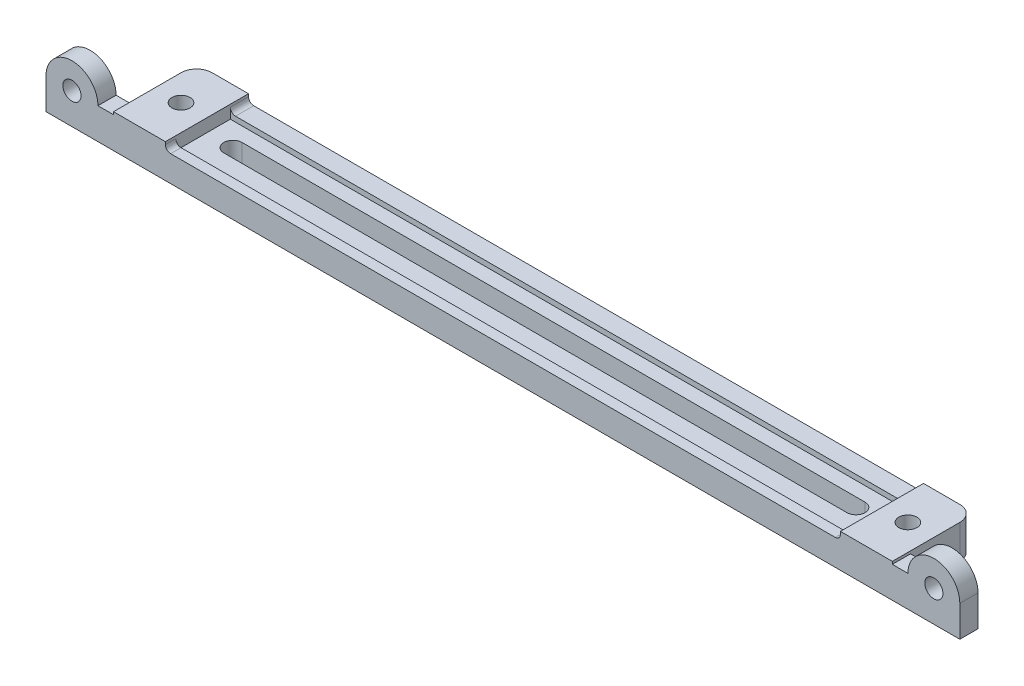
ISO-10303-21;
HEADER;
FILE_DESCRIPTION(('STEP AP214'),'2;1');
FILE_NAME('part.step','',(''),(''),'','','');
FILE_SCHEMA(('AUTOMOTIVE_DESIGN { 1 0 10303 214 1 1 1 1 }'));
ENDSEC;
DATA;
#1=APPLICATION_CONTEXT('core data for automotive mechanical design processes');
#2=APPLICATION_PROTOCOL_DEFINITION('international standard','automotive_design',2000,#1);
#3=PRODUCT_CONTEXT('',#1,'mechanical');
#4=PRODUCT('Part','Part','',(#3));
#5=PRODUCT_RELATED_PRODUCT_CATEGORY('part','',(#4));
#6=PRODUCT_DEFINITION_FORMATION('','',#4);
#7=PRODUCT_DEFINITION_CONTEXT('part definition',#1,'design');
#8=PRODUCT_DEFINITION('design','',#6,#7);
#9=PRODUCT_DEFINITION_SHAPE('','',#8);
#10=(LENGTH_UNIT() NAMED_UNIT(*) SI_UNIT(.MILLI.,.METRE.));
#11=(NAMED_UNIT(*) PLANE_ANGLE_UNIT() SI_UNIT($,.RADIAN.));
#12=(NAMED_UNIT(*) SI_UNIT($,.STERADIAN.) SOLID_ANGLE_UNIT());
#13=UNCERTAINTY_MEASURE_WITH_UNIT(LENGTH_MEASURE(1.E-05),#10,'distance_accuracy_value','');
#14=(GEOMETRIC_REPRESENTATION_CONTEXT(3) GLOBAL_UNCERTAINTY_ASSIGNED_CONTEXT((#13)) GLOBAL_UNIT_ASSIGNED_CONTEXT((#10,
#11,#12)) REPRESENTATION_CONTEXT('',''));
#15=CARTESIAN_POINT('',(0.,0.,0.));
#16=DIRECTION('',(0.,0.,1.));
#17=DIRECTION('',(1.,0.,0.));
#18=AXIS2_PLACEMENT_3D('',#15,#16,#17);
#19=CARTESIAN_POINT('',(-75.,4.,0.));
#20=DIRECTION('',(-1.,0.,0.));
#21=DIRECTION('',(0.,0.,1.));
#22=AXIS2_PLACEMENT_3D('',#19,#20,#21);
#23=PLANE('',#22);
#24=DIRECTION('',(0.,-1.,0.));
#25=VECTOR('',#24,1.);
#26=CARTESIAN_POINT('',(-75.,0.,4.49999999999999));
#27=LINE('',#26,#25);
#28=CARTESIAN_POINT('',(-75.,6.,4.49999999999999));
#29=VERTEX_POINT('',#28);
#30=CARTESIAN_POINT('',(-75.,0.,4.49999999999999));
#31=VERTEX_POINT('',#30);
#32=EDGE_CURVE('E286',#29,#31,#27,.T.);
#33=ORIENTED_EDGE('',*,*,#32,.F.);
#34=DIRECTION('',(0.,0.,1.));
#35=VECTOR('',#34,1.);
#36=CARTESIAN_POINT('',(-75.,6.,4.49999999999999));
#37=LINE('',#36,#35);
#38=CARTESIAN_POINT('',(-75.,6.,7.99999999999999));
#39=VERTEX_POINT('',#38);
#40=EDGE_CURVE('E307',#29,#39,#37,.T.);
#41=ORIENTED_EDGE('',*,*,#40,.T.);
#42=DIRECTION('',(0.,-1.,0.));
#43=VECTOR('',#42,1.);
#44=CARTESIAN_POINT('',(-75.,4.,8.00000000000001));
#45=LINE('',#44,#43);
#46=CARTESIAN_POINT('',(-75.,6.5,8.00000000000001));
#47=VERTEX_POINT('',#46);
#48=EDGE_CURVE('E442',#47,#39,#45,.T.);
#49=ORIENTED_EDGE('',*,*,#48,.F.);
#50=DIRECTION('',(0.,0.,1.));
#51=VECTOR('',#50,1.);
#52=CARTESIAN_POINT('',(-75.,6.5,-4.99999999999997));
#53=LINE('',#52,#51);
#54=CARTESIAN_POINT('',(-75.,6.5,-4.99999999999997));
#55=VERTEX_POINT('',#54);
#56=EDGE_CURVE('E325',#55,#47,#53,.T.);
#57=ORIENTED_EDGE('',*,*,#56,.F.);
#58=DIRECTION('',(0.,-1.,0.));
#59=VECTOR('',#58,1.);
#60=CARTESIAN_POINT('',(-75.,4.,-4.99999999999997));
#61=LINE('',#60,#59);
#62=CARTESIAN_POINT('',(-75.,0.,-4.99999999999997));
#63=VERTEX_POINT('',#62);
#64=EDGE_CURVE('E445',#55,#63,#61,.T.);
#65=ORIENTED_EDGE('',*,*,#64,.T.);
#66=DIRECTION('',(0.,0.,-1.));
#67=VECTOR('',#66,1.);
#68=CARTESIAN_POINT('',(-75.,0.,0.));
#69=LINE('',#68,#67);
#70=EDGE_CURVE('E427',#31,#63,#69,.T.);
#71=ORIENTED_EDGE('',*,*,#70,.F.);
#72=EDGE_LOOP('',(#33,#41,#49,#57,#65,#71));
#73=FACE_BOUND('',#72,.T.);
#74=ADVANCED_FACE('F35',(#73),#23,.T.);
#75=CARTESIAN_POINT('',(0.,5.,0.));
#76=DIRECTION('',(0.,1.,0.));
#77=DIRECTION('',(0.,0.,1.));
#78=AXIS2_PLACEMENT_3D('',#75,#76,#77);
#79=PLANE('',#78);
#80=DIRECTION('',(1.,0.,0.));
#81=VECTOR('',#80,1.);
#82=CARTESIAN_POINT('',(0.,5.,-4.50000000000002));
#83=LINE('',#82,#81);
#84=CARTESIAN_POINT('',(-64.,5.,-4.50000000000002));
#85=VERTEX_POINT('',#84);
#86=CARTESIAN_POINT('',(64.,5.,-4.50000000000002));
#87=VERTEX_POINT('',#86);
#88=EDGE_CURVE('E368',#85,#87,#83,.T.);
#89=ORIENTED_EDGE('',*,*,#88,.T.);
#90=DIRECTION('',(0.,0.,1.));
#91=VECTOR('',#90,1.);
#92=CARTESIAN_POINT('',(64.,5.,-8.00000000000001));
#93=LINE('',#92,#91);
#94=CARTESIAN_POINT('',(64.,5.,-8.00000000000001));
#95=VERTEX_POINT('',#94);
#96=EDGE_CURVE('E467',#87,#95,#93,.F.);
#97=ORIENTED_EDGE('',*,*,#96,.T.);
#98=DIRECTION('',(-1.,0.,0.));
#99=VECTOR('',#98,1.);
#100=CARTESIAN_POINT('',(0.,5.,-8.00000000000001));
#101=LINE('',#100,#99);
#102=CARTESIAN_POINT('',(-64.,5.,-8.));
#103=VERTEX_POINT('',#102);
#104=EDGE_CURVE('E361',#95,#103,#101,.T.);
#105=ORIENTED_EDGE('',*,*,#104,.T.);
#106=DIRECTION('',(0.,0.,1.));
#107=VECTOR('',#106,1.);
#108=CARTESIAN_POINT('',(-64.,5.,0.));
#109=LINE('',#108,#107);
#110=EDGE_CURVE('E464',#103,#85,#109,.T.);
#111=ORIENTED_EDGE('',*,*,#110,.T.);
#112=EDGE_LOOP('',(#89,#97,#105,#111));
#113=FACE_BOUND('',#112,.T.);
#114=ADVANCED_FACE('F556',(#113),#79,.T.);
#115=DIRECTION('',(1.,0.,0.));
#116=VECTOR('',#115,1.);
#117=CARTESIAN_POINT('',(0.,5.,7.99999999999999));
#118=LINE('',#117,#116);
#119=CARTESIAN_POINT('',(-64.0000000000001,5.,8.));
#120=VERTEX_POINT('',#119);
#121=CARTESIAN_POINT('',(64.,5.,7.99999999999998));
#122=VERTEX_POINT('',#121);
#123=EDGE_CURVE('E364',#120,#122,#118,.T.);
#124=ORIENTED_EDGE('',*,*,#123,.T.);
#125=DIRECTION('',(0.,0.,1.));
#126=VECTOR('',#125,1.);
#127=CARTESIAN_POINT('',(64.,5.,5.99999999999998));
#128=LINE('',#127,#126);
#129=CARTESIAN_POINT('',(64.,5.,5.99999999999998));
#130=VERTEX_POINT('',#129);
#131=EDGE_CURVE('E471',#122,#130,#128,.F.);
#132=ORIENTED_EDGE('',*,*,#131,.T.);
#133=DIRECTION('',(1.,0.,0.));
#134=VECTOR('',#133,1.);
#135=CARTESIAN_POINT('',(0.,5.,5.99999999999998));
#136=LINE('',#135,#134);
#137=CARTESIAN_POINT('',(-64.0000000000001,5.,5.99999999999998));
#138=VERTEX_POINT('',#137);
#139=EDGE_CURVE('E371',#138,#130,#136,.T.);
#140=ORIENTED_EDGE('',*,*,#139,.F.);
#141=DIRECTION('',(0.,0.,-1.));
#142=VECTOR('',#141,1.);
#143=CARTESIAN_POINT('',(-64.,5.,0.));
#144=LINE('',#143,#142);
#145=EDGE_CURVE('E469',#138,#120,#144,.F.);
#146=ORIENTED_EDGE('',*,*,#145,.T.);
#147=EDGE_LOOP('',(#124,#132,#140,#146));
#148=FACE_BOUND('',#147,.T.);
#149=ADVANCED_FACE('F501',(#148),#79,.T.);
#150=CARTESIAN_POINT('',(0.,4.,-8.00000000000001));
#151=DIRECTION('',(0.,0.,1.));
#152=DIRECTION('',(1.,0.,0.));
#153=AXIS2_PLACEMENT_3D('',#150,#151,#152);
#154=PLANE('',#153);
#155=DIRECTION('',(-1.,0.,0.));
#156=VECTOR('',#155,1.);
#157=CARTESIAN_POINT('',(0.,0.,-8.00000000000001));
#158=LINE('',#157,#156);
#159=CARTESIAN_POINT('',(72.,0.,-8.00000000000002));
#160=VERTEX_POINT('',#159);
#161=CARTESIAN_POINT('',(-72.,0.,-7.99999999999999));
#162=VERTEX_POINT('',#161);
#163=EDGE_CURVE('E421',#160,#162,#158,.T.);
#164=ORIENTED_EDGE('',*,*,#163,.T.);
#165=DIRECTION('',(0.,-1.,0.));
#166=VECTOR('',#165,1.);
#167=CARTESIAN_POINT('',(-72.,4.,-7.99999999999999));
#168=LINE('',#167,#166);
#169=CARTESIAN_POINT('',(-72.,6.5,-8.));
#170=VERTEX_POINT('',#169);
#171=EDGE_CURVE('E448',#170,#162,#168,.T.);
#172=ORIENTED_EDGE('',*,*,#171,.F.);
#173=DIRECTION('',(-1.,0.,0.));
#174=VECTOR('',#173,1.);
#175=CARTESIAN_POINT('',(-65.0000000000001,6.5,-8.));
#176=LINE('',#175,#174);
#177=CARTESIAN_POINT('',(-65.0000000000001,6.5,-8.));
#178=VERTEX_POINT('',#177);
#179=EDGE_CURVE('E319',#178,#170,#176,.T.);
#180=ORIENTED_EDGE('',*,*,#179,.F.);
#181=DIRECTION('',(0.,-1.,0.));
#182=VECTOR('',#181,1.);
#183=CARTESIAN_POINT('',(-65.0000000000001,6.5,-8.));
#184=LINE('',#183,#182);
#185=CARTESIAN_POINT('',(-65.0000000000001,6.,-8.));
#186=VERTEX_POINT('',#185);
#187=EDGE_CURVE('E334',#178,#186,#184,.T.);
#188=ORIENTED_EDGE('',*,*,#187,.T.);
#189=CARTESIAN_POINT('',(-64.,6.,-8.));
#190=DIRECTION('',(0.,0.,1.));
#191=DIRECTION('',(1.,0.,0.));
#192=AXIS2_PLACEMENT_3D('',#189,#190,#191);
#193=CIRCLE('',#192,1.);
#194=EDGE_CURVE('E490',#186,#103,#193,.T.);
#195=ORIENTED_EDGE('',*,*,#194,.T.);
#196=ORIENTED_EDGE('',*,*,#104,.F.);
#197=CARTESIAN_POINT('',(64.,6.,-8.00000000000001));
#198=DIRECTION('',(0.,0.,1.));
#199=DIRECTION('',(1.,0.,0.));
#200=AXIS2_PLACEMENT_3D('',#197,#198,#199);
#201=CIRCLE('',#200,1.);
#202=CARTESIAN_POINT('',(65.,6.,-8.00000000000002));
#203=VERTEX_POINT('',#202);
#204=EDGE_CURVE('E480',#95,#203,#201,.T.);
#205=ORIENTED_EDGE('',*,*,#204,.T.);
#206=DIRECTION('',(0.,-1.,0.));
#207=VECTOR('',#206,1.);
#208=CARTESIAN_POINT('',(65.,6.5,-8.00000000000002));
#209=LINE('',#208,#207);
#210=CARTESIAN_POINT('',(65.,6.5,-8.00000000000002));
#211=VERTEX_POINT('',#210);
#212=EDGE_CURVE('E354',#211,#203,#209,.T.);
#213=ORIENTED_EDGE('',*,*,#212,.F.);
#214=DIRECTION('',(-1.,0.,0.));
#215=VECTOR('',#214,1.);
#216=CARTESIAN_POINT('',(72.,6.5,-8.00000000000002));
#217=LINE('',#216,#215);
#218=CARTESIAN_POINT('',(72.,6.5,-8.00000000000002));
#219=VERTEX_POINT('',#218);
#220=EDGE_CURVE('E351',#219,#211,#217,.T.);
#221=ORIENTED_EDGE('',*,*,#220,.F.);
#222=DIRECTION('',(0.,-1.,0.));
#223=VECTOR('',#222,1.);
#224=CARTESIAN_POINT('',(72.,4.,-8.00000000000002));
#225=LINE('',#224,#223);
#226=EDGE_CURVE('E435',#219,#160,#225,.T.);
#227=ORIENTED_EDGE('',*,*,#226,.T.);
#228=EDGE_LOOP('',(#164,#172,#180,#188,#195,#196,#205,#213,#221,#227));
#229=FACE_BOUND('',#228,.T.);
#230=ADVANCED_FACE('F571',(#229),#154,.F.);
#231=CARTESIAN_POINT('',(-72.,4.,-5.));
#232=DIRECTION('',(0.,-1.,0.));
#233=DIRECTION('',(0.,0.,-1.));
#234=AXIS2_PLACEMENT_3D('',#231,#232,#233);
#235=CYLINDRICAL_SURFACE('',#234,3.);
#236=CARTESIAN_POINT('',(-72.,0.,-5.));
#237=DIRECTION('',(0.,1.,0.));
#238=DIRECTION('',(0.,0.,1.));
#239=AXIS2_PLACEMENT_3D('',#236,#237,#238);
#240=CIRCLE('',#239,3.);
#241=EDGE_CURVE('E424',#162,#63,#240,.T.);
#242=ORIENTED_EDGE('',*,*,#241,.T.);
#243=ORIENTED_EDGE('',*,*,#64,.F.);
#244=CARTESIAN_POINT('',(-72.,6.5,-4.99999999999999));
#245=DIRECTION('',(0.,1.,0.));
#246=DIRECTION('',(0.,0.,1.));
#247=AXIS2_PLACEMENT_3D('',#244,#245,#246);
#248=CIRCLE('',#247,3.00000000000001);
#249=EDGE_CURVE('E322',#170,#55,#248,.T.);
#250=ORIENTED_EDGE('',*,*,#249,.F.);
#251=ORIENTED_EDGE('',*,*,#171,.T.);
#252=EDGE_LOOP('',(#242,#243,#250,#251));
#253=FACE_BOUND('',#252,.T.);
#254=ADVANCED_FACE('F568',(#253),#235,.T.);
#255=CARTESIAN_POINT('',(0.,4.,7.99999999999999));
#256=DIRECTION('',(0.,0.,1.));
#257=DIRECTION('',(1.,0.,0.));
#258=AXIS2_PLACEMENT_3D('',#255,#256,#257);
#259=PLANE('',#258);
#260=DIRECTION('',(-1.,0.,0.));
#261=VECTOR('',#260,1.);
#262=CARTESIAN_POINT('',(0.,0.,7.99999999999999));
#263=LINE('',#262,#261);
#264=CARTESIAN_POINT('',(88.,1.4209566642787E-12,7.99999999999999));
#265=VERTEX_POINT('',#264);
#266=CARTESIAN_POINT('',(-88.,0.,7.99999999999999));
#267=VERTEX_POINT('',#266);
#268=EDGE_CURVE('E429',#265,#267,#263,.T.);
#269=ORIENTED_EDGE('',*,*,#268,.F.);
#270=DIRECTION('',(0.,1.,0.));
#271=VECTOR('',#270,1.);
#272=CARTESIAN_POINT('',(88.,1.22124532708767E-12,7.99999999999999));
#273=LINE('',#272,#271);
#274=CARTESIAN_POINT('',(88.,6.00000000000142,7.99999999999999));
#275=VERTEX_POINT('',#274);
#276=EDGE_CURVE('E269',#265,#275,#273,.T.);
#277=ORIENTED_EDGE('',*,*,#276,.T.);
#278=CARTESIAN_POINT('',(82.9999999999999,6.00000000000134,7.99999999999999));
#279=DIRECTION('',(0.,0.,1.));
#280=DIRECTION('',(1.,0.,0.));
#281=AXIS2_PLACEMENT_3D('',#278,#279,#280);
#282=CIRCLE('',#281,5.);
#283=CARTESIAN_POINT('',(77.9999999999999,6.00000000000126,7.99999999999999));
#284=VERTEX_POINT('',#283);
#285=EDGE_CURVE('E235',#275,#284,#282,.T.);
#286=ORIENTED_EDGE('',*,*,#285,.T.);
#287=DIRECTION('',(-1.,0.,0.));
#288=VECTOR('',#287,1.);
#289=CARTESIAN_POINT('',(0.,5.99999999999999,7.99999999999999));
#290=LINE('',#289,#288);
#291=CARTESIAN_POINT('',(75.,6.00000000000123,7.99999999999998));
#292=VERTEX_POINT('',#291);
#293=EDGE_CURVE('E259',#284,#292,#290,.T.);
#294=ORIENTED_EDGE('',*,*,#293,.T.);
#295=DIRECTION('',(0.,-1.,0.));
#296=VECTOR('',#295,1.);
#297=CARTESIAN_POINT('',(75.,4.,7.99999999999998));
#298=LINE('',#297,#296);
#299=CARTESIAN_POINT('',(75.,6.5,7.99999999999998));
#300=VERTEX_POINT('',#299);
#301=EDGE_CURVE('E55',#300,#292,#298,.T.);
#302=ORIENTED_EDGE('',*,*,#301,.F.);
#303=DIRECTION('',(1.,0.,0.));
#304=VECTOR('',#303,1.);
#305=CARTESIAN_POINT('',(65.,6.5,7.99999999999998));
#306=LINE('',#305,#304);
#307=CARTESIAN_POINT('',(65.,6.5,7.99999999999998));
#308=VERTEX_POINT('',#307);
#309=EDGE_CURVE('E342',#308,#300,#306,.T.);
#310=ORIENTED_EDGE('',*,*,#309,.F.);
#311=DIRECTION('',(0.,-1.,0.));
#312=VECTOR('',#311,1.);
#313=CARTESIAN_POINT('',(65.,6.5,7.99999999999998));
#314=LINE('',#313,#312);
#315=CARTESIAN_POINT('',(65.,6.,7.99999999999998));
#316=VERTEX_POINT('',#315);
#317=EDGE_CURVE('E357',#308,#316,#314,.T.);
#318=ORIENTED_EDGE('',*,*,#317,.T.);
#319=CARTESIAN_POINT('',(64.,6.,7.99999999999998));
#320=DIRECTION('',(0.,0.,1.));
#321=DIRECTION('',(1.,0.,0.));
#322=AXIS2_PLACEMENT_3D('',#319,#320,#321);
#323=CIRCLE('',#322,1.);
#324=EDGE_CURVE('E482',#316,#122,#323,.F.);
#325=ORIENTED_EDGE('',*,*,#324,.T.);
#326=ORIENTED_EDGE('',*,*,#123,.F.);
#327=CARTESIAN_POINT('',(-64.0000000000001,6.,8.));
#328=DIRECTION('',(0.,0.,1.));
#329=DIRECTION('',(1.,0.,0.));
#330=AXIS2_PLACEMENT_3D('',#327,#328,#329);
#331=CIRCLE('',#330,1.);
#332=CARTESIAN_POINT('',(-65.,6.,8.));
#333=VERTEX_POINT('',#332);
#334=EDGE_CURVE('E11',#120,#333,#331,.F.);
#335=ORIENTED_EDGE('',*,*,#334,.T.);
#336=DIRECTION('',(0.,-1.,0.));
#337=VECTOR('',#336,1.);
#338=CARTESIAN_POINT('',(-65.,6.5,8.));
#339=LINE('',#338,#337);
#340=CARTESIAN_POINT('',(-65.,6.5,8.));
#341=VERTEX_POINT('',#340);
#342=EDGE_CURVE('E331',#341,#333,#339,.T.);
#343=ORIENTED_EDGE('',*,*,#342,.F.);
#344=DIRECTION('',(1.,0.,0.));
#345=VECTOR('',#344,1.);
#346=CARTESIAN_POINT('',(-75.,6.5,8.00000000000001));
#347=LINE('',#346,#345);
#348=EDGE_CURVE('E328',#47,#341,#347,.T.);
#349=ORIENTED_EDGE('',*,*,#348,.F.);
#350=ORIENTED_EDGE('',*,*,#48,.T.);
#351=DIRECTION('',(1.,0.,0.));
#352=VECTOR('',#351,1.);
#353=CARTESIAN_POINT('',(0.,6.,7.99999999999999));
#354=LINE('',#353,#352);
#355=CARTESIAN_POINT('',(-78.,6.,7.99999999999999));
#356=VERTEX_POINT('',#355);
#357=EDGE_CURVE('E299',#356,#39,#354,.T.);
#358=ORIENTED_EDGE('',*,*,#357,.F.);
#359=CARTESIAN_POINT('',(-83.,6.,7.99999999999999));
#360=DIRECTION('',(0.,0.,1.));
#361=DIRECTION('',(1.,0.,0.));
#362=AXIS2_PLACEMENT_3D('',#359,#360,#361);
#363=CIRCLE('',#362,5.);
#364=CARTESIAN_POINT('',(-88.,6.,7.99999999999999));
#365=VERTEX_POINT('',#364);
#366=EDGE_CURVE('E275',#365,#356,#363,.F.);
#367=ORIENTED_EDGE('',*,*,#366,.F.);
#368=DIRECTION('',(0.,1.,0.));
#369=VECTOR('',#368,1.);
#370=CARTESIAN_POINT('',(-88.,0.,7.99999999999999));
#371=LINE('',#370,#369);
#372=EDGE_CURVE('E297',#267,#365,#371,.T.);
#373=ORIENTED_EDGE('',*,*,#372,.F.);
#374=EDGE_LOOP('',(#269,#277,#286,#294,#302,#310,#318,#325,#326,#335,#343,#349,#350,#358,#367,#373));
#375=FACE_BOUND('',#374,.T.);
#376=CARTESIAN_POINT('',(-83.,6.,7.99999999999999));
#377=DIRECTION('',(0.,0.,1.));
#378=DIRECTION('',(1.,0.,0.));
#379=AXIS2_PLACEMENT_3D('',#376,#377,#378);
#380=CIRCLE('',#379,1.75);
#381=CARTESIAN_POINT('',(-81.25,6.,7.99999999999999));
#382=VERTEX_POINT('',#381);
#383=EDGE_CURVE('E282',#382,#382,#380,.T.);
#384=ORIENTED_EDGE('',*,*,#383,.F.);
#385=EDGE_LOOP('',(#384));
#386=FACE_BOUND('',#385,.T.);
#387=CARTESIAN_POINT('',(82.9999999999999,6.00000000000134,7.99999999999999));
#388=DIRECTION('',(0.,0.,1.));
#389=DIRECTION('',(1.,0.,0.));
#390=AXIS2_PLACEMENT_3D('',#387,#388,#389);
#391=CIRCLE('',#390,1.75000000000002);
#392=CARTESIAN_POINT('',(84.75,6.00000000000134,7.99999999999999));
#393=VERTEX_POINT('',#392);
#394=EDGE_CURVE('E266',#393,#393,#391,.F.);
#395=ORIENTED_EDGE('',*,*,#394,.T.);
#396=EDGE_LOOP('',(#395));
#397=FACE_BOUND('',#396,.T.);
#398=ADVANCED_FACE('F507',(#375,#386,#397),#259,.T.);
#399=CARTESIAN_POINT('',(75.,4.,0.));
#400=DIRECTION('',(-1.,0.,0.));
#401=DIRECTION('',(0.,0.,1.));
#402=AXIS2_PLACEMENT_3D('',#399,#400,#401);
#403=PLANE('',#402);
#404=ORIENTED_EDGE('',*,*,#301,.T.);
#405=DIRECTION('',(0.,0.,1.));
#406=VECTOR('',#405,1.);
#407=CARTESIAN_POINT('',(75.,6.00000000000121,4.49999999999999));
#408=LINE('',#407,#406);
#409=CARTESIAN_POINT('',(75.,6.00000000000121,4.49999999999999));
#410=VERTEX_POINT('',#409);
#411=EDGE_CURVE('E50',#410,#292,#408,.T.);
#412=ORIENTED_EDGE('',*,*,#411,.F.);
#413=DIRECTION('',(0.,1.,0.));
#414=VECTOR('',#413,1.);
#415=CARTESIAN_POINT('',(75.,0.,4.49999999999999));
#416=LINE('',#415,#414);
#417=CARTESIAN_POINT('',(75.,0.,4.49999999999999));
#418=VERTEX_POINT('',#417);
#419=EDGE_CURVE('E263',#418,#410,#416,.T.);
#420=ORIENTED_EDGE('',*,*,#419,.F.);
#421=DIRECTION('',(0.,0.,-1.));
#422=VECTOR('',#421,1.);
#423=CARTESIAN_POINT('',(75.,0.,0.));
#424=LINE('',#423,#422);
#425=CARTESIAN_POINT('',(75.,0.,-4.99999999999999));
#426=VERTEX_POINT('',#425);
#427=EDGE_CURVE('E431',#418,#426,#424,.T.);
#428=ORIENTED_EDGE('',*,*,#427,.T.);
#429=DIRECTION('',(0.,-1.,0.));
#430=VECTOR('',#429,1.);
#431=CARTESIAN_POINT('',(75.,4.,-4.99999999999999));
#432=LINE('',#431,#430);
#433=CARTESIAN_POINT('',(75.,6.5,-4.99999999999999));
#434=VERTEX_POINT('',#433);
#435=EDGE_CURVE('E437',#434,#426,#432,.T.);
#436=ORIENTED_EDGE('',*,*,#435,.F.);
#437=DIRECTION('',(0.,0.,-1.));
#438=VECTOR('',#437,1.);
#439=CARTESIAN_POINT('',(75.,6.5,7.99999999999998));
#440=LINE('',#439,#438);
#441=EDGE_CURVE('E345',#300,#434,#440,.T.);
#442=ORIENTED_EDGE('',*,*,#441,.F.);
#443=EDGE_LOOP('',(#404,#412,#420,#428,#436,#442));
#444=FACE_BOUND('',#443,.T.);
#445=ADVANCED_FACE('F600',(#444),#403,.F.);
#446=CARTESIAN_POINT('',(0.,4.,-1.75000000000001));
#447=DIRECTION('',(0.,0.,1.));
#448=DIRECTION('',(1.,0.,0.));
#449=AXIS2_PLACEMENT_3D('',#446,#447,#448);
#450=PLANE('',#449);
#451=DIRECTION('',(-1.,0.,0.));
#452=VECTOR('',#451,1.);
#453=CARTESIAN_POINT('',(0.,0.,-1.75000000000001));
#454=LINE('',#453,#452);
#455=CARTESIAN_POINT('',(60.,0.,-1.75000000000002));
#456=VERTEX_POINT('',#455);
#457=CARTESIAN_POINT('',(-60.,0.,-1.75));
#458=VERTEX_POINT('',#457);
#459=EDGE_CURVE('E392',#456,#458,#454,.T.);
#460=ORIENTED_EDGE('',*,*,#459,.F.);
#461=DIRECTION('',(0.,-1.,0.));
#462=VECTOR('',#461,1.);
#463=CARTESIAN_POINT('',(60.,4.,-1.75000000000002));
#464=LINE('',#463,#462);
#465=CARTESIAN_POINT('',(60.,4.,-1.75000000000002));
#466=VERTEX_POINT('',#465);
#467=EDGE_CURVE('E438',#466,#456,#464,.T.);
#468=ORIENTED_EDGE('',*,*,#467,.F.);
#469=DIRECTION('',(-1.,0.,0.));
#470=VECTOR('',#469,1.);
#471=CARTESIAN_POINT('',(0.,4.,-1.75000000000001));
#472=LINE('',#471,#470);
#473=CARTESIAN_POINT('',(-60.,4.,-1.75));
#474=VERTEX_POINT('',#473);
#475=EDGE_CURVE('E393',#466,#474,#472,.T.);
#476=ORIENTED_EDGE('',*,*,#475,.T.);
#477=DIRECTION('',(0.,-1.,0.));
#478=VECTOR('',#477,1.);
#479=CARTESIAN_POINT('',(-60.,4.,-1.75));
#480=LINE('',#479,#478);
#481=EDGE_CURVE('E404',#474,#458,#480,.T.);
#482=ORIENTED_EDGE('',*,*,#481,.T.);
#483=EDGE_LOOP('',(#460,#468,#476,#482));
#484=FACE_BOUND('',#483,.T.);
#485=ADVANCED_FACE('F596',(#484),#450,.T.);
#486=CARTESIAN_POINT('',(60.,4.,-2.11419423634673E-13));
#487=DIRECTION('',(0.,-1.,0.));
#488=DIRECTION('',(0.,0.,-1.));
#489=AXIS2_PLACEMENT_3D('',#486,#487,#488);
#490=CYLINDRICAL_SURFACE('',#489,1.75);
#491=CARTESIAN_POINT('',(60.,0.,-2.11419423634673E-13));
#492=DIRECTION('',(0.,1.,0.));
#493=DIRECTION('',(0.,0.,1.));
#494=AXIS2_PLACEMENT_3D('',#491,#492,#493);
#495=CIRCLE('',#494,1.75);
#496=CARTESIAN_POINT('',(60.,0.,1.74999999999998));
#497=VERTEX_POINT('',#496);
#498=EDGE_CURVE('E407',#456,#497,#495,.F.);
#499=ORIENTED_EDGE('',*,*,#498,.T.);
#500=DIRECTION('',(0.,-1.,0.));
#501=VECTOR('',#500,1.);
#502=CARTESIAN_POINT('',(60.,4.,1.74999999999998));
#503=LINE('',#502,#501);
#504=CARTESIAN_POINT('',(60.,4.,1.74999999999998));
#505=VERTEX_POINT('',#504);
#506=EDGE_CURVE('E455',#505,#497,#503,.T.);
#507=ORIENTED_EDGE('',*,*,#506,.F.);
#508=CARTESIAN_POINT('',(60.,4.,-2.11419423634673E-13));
#509=DIRECTION('',(0.,1.,0.));
#510=DIRECTION('',(0.,0.,1.));
#511=AXIS2_PLACEMENT_3D('',#508,#509,#510);
#512=CIRCLE('',#511,1.75);
#513=EDGE_CURVE('E396',#466,#505,#512,.F.);
#514=ORIENTED_EDGE('',*,*,#513,.F.);
#515=ORIENTED_EDGE('',*,*,#467,.T.);
#516=EDGE_LOOP('',(#499,#507,#514,#515));
#517=FACE_BOUND('',#516,.T.);
#518=ADVANCED_FACE('F592',(#517),#490,.F.);
#519=CARTESIAN_POINT('',(0.,4.,1.74999999999999));
#520=DIRECTION('',(0.,0.,1.));
#521=DIRECTION('',(1.,0.,0.));
#522=AXIS2_PLACEMENT_3D('',#519,#520,#521);
#523=PLANE('',#522);
#524=DIRECTION('',(-1.,0.,0.));
#525=VECTOR('',#524,1.);
#526=CARTESIAN_POINT('',(0.,0.,1.74999999999999));
#527=LINE('',#526,#525);
#528=CARTESIAN_POINT('',(-60.,0.,1.75));
#529=VERTEX_POINT('',#528);
#530=EDGE_CURVE('E409',#497,#529,#527,.T.);
#531=ORIENTED_EDGE('',*,*,#530,.T.);
#532=DIRECTION('',(0.,-1.,0.));
#533=VECTOR('',#532,1.);
#534=CARTESIAN_POINT('',(-60.,4.,1.75));
#535=LINE('',#534,#533);
#536=CARTESIAN_POINT('',(-60.,4.,1.75));
#537=VERTEX_POINT('',#536);
#538=EDGE_CURVE('E453',#537,#529,#535,.T.);
#539=ORIENTED_EDGE('',*,*,#538,.F.);
#540=DIRECTION('',(-1.,0.,0.));
#541=VECTOR('',#540,1.);
#542=CARTESIAN_POINT('',(0.,4.,1.74999999999999));
#543=LINE('',#542,#541);
#544=EDGE_CURVE('E399',#505,#537,#543,.T.);
#545=ORIENTED_EDGE('',*,*,#544,.F.);
#546=ORIENTED_EDGE('',*,*,#506,.T.);
#547=EDGE_LOOP('',(#531,#539,#545,#546));
#548=FACE_BOUND('',#547,.T.);
#549=ADVANCED_FACE('F580',(#548),#523,.F.);
#550=CARTESIAN_POINT('',(-70.,4.,0.));
#551=DIRECTION('',(0.,-1.,0.));
#552=DIRECTION('',(0.,0.,-1.));
#553=AXIS2_PLACEMENT_3D('',#550,#551,#552);
#554=CYLINDRICAL_SURFACE('',#553,1.75);
#555=CARTESIAN_POINT('',(-70.,0.,0.));
#556=DIRECTION('',(0.,1.,0.));
#557=DIRECTION('',(0.,0.,1.));
#558=AXIS2_PLACEMENT_3D('',#555,#556,#557);
#559=CIRCLE('',#558,1.75);
#560=CARTESIAN_POINT('',(-70.,0.,1.75));
#561=VERTEX_POINT('',#560);
#562=EDGE_CURVE('E418',#561,#561,#559,.T.);
#563=ORIENTED_EDGE('',*,*,#562,.F.);
#564=EDGE_LOOP('',(#563));
#565=FACE_BOUND('',#564,.T.);
#566=CARTESIAN_POINT('',(-70.,6.5,0.));
#567=DIRECTION('',(0.,1.,0.));
#568=DIRECTION('',(0.,0.,1.));
#569=AXIS2_PLACEMENT_3D('',#566,#567,#568);
#570=CIRCLE('',#569,1.75);
#571=CARTESIAN_POINT('',(-70.,6.5,1.75));
#572=VERTEX_POINT('',#571);
#573=EDGE_CURVE('E306',#572,#572,#570,.T.);
#574=ORIENTED_EDGE('',*,*,#573,.T.);
#575=EDGE_LOOP('',(#574));
#576=FACE_BOUND('',#575,.T.);
#577=ADVANCED_FACE('F576',(#565,#576),#554,.F.);
#578=CARTESIAN_POINT('',(70.,4.,-2.42861286636753E-13));
#579=DIRECTION('',(0.,-1.,0.));
#580=DIRECTION('',(0.,0.,-1.));
#581=AXIS2_PLACEMENT_3D('',#578,#579,#580);
#582=CYLINDRICAL_SURFACE('',#581,1.75);
#583=CARTESIAN_POINT('',(70.,0.,-2.42861286636753E-13));
#584=DIRECTION('',(0.,1.,0.));
#585=DIRECTION('',(0.,0.,1.));
#586=AXIS2_PLACEMENT_3D('',#583,#584,#585);
#587=CIRCLE('',#586,1.75);
#588=CARTESIAN_POINT('',(70.,0.,1.74999999999975));
#589=VERTEX_POINT('',#588);
#590=EDGE_CURVE('E415',#589,#589,#587,.F.);
#591=ORIENTED_EDGE('',*,*,#590,.T.);
#592=EDGE_LOOP('',(#591));
#593=FACE_BOUND('',#592,.T.);
#594=CARTESIAN_POINT('',(70.,6.5,-2.42861286636753E-13));
#595=DIRECTION('',(0.,1.,0.));
#596=DIRECTION('',(0.,0.,1.));
#597=AXIS2_PLACEMENT_3D('',#594,#595,#596);
#598=CIRCLE('',#597,1.75);
#599=CARTESIAN_POINT('',(70.,6.5,1.74999999999975));
#600=VERTEX_POINT('',#599);
#601=EDGE_CURVE('E337',#600,#600,#598,.T.);
#602=ORIENTED_EDGE('',*,*,#601,.T.);
#603=EDGE_LOOP('',(#602));
#604=FACE_BOUND('',#603,.T.);
#605=ADVANCED_FACE('F579',(#593,#604),#582,.F.);
#606=CARTESIAN_POINT('',(-60.,4.,0.));
#607=DIRECTION('',(0.,-1.,0.));
#608=DIRECTION('',(0.,0.,-1.));
#609=AXIS2_PLACEMENT_3D('',#606,#607,#608);
#610=CYLINDRICAL_SURFACE('',#609,1.75);
#611=CARTESIAN_POINT('',(-60.,0.,0.));
#612=DIRECTION('',(0.,1.,0.));
#613=DIRECTION('',(0.,0.,1.));
#614=AXIS2_PLACEMENT_3D('',#611,#612,#613);
#615=CIRCLE('',#614,1.75);
#616=EDGE_CURVE('E412',#458,#529,#615,.T.);
#617=ORIENTED_EDGE('',*,*,#616,.F.);
#618=ORIENTED_EDGE('',*,*,#481,.F.);
#619=CARTESIAN_POINT('',(-60.,4.,0.));
#620=DIRECTION('',(0.,1.,0.));
#621=DIRECTION('',(0.,0.,1.));
#622=AXIS2_PLACEMENT_3D('',#619,#620,#621);
#623=CIRCLE('',#622,1.75);
#624=EDGE_CURVE('E401',#474,#537,#623,.T.);
#625=ORIENTED_EDGE('',*,*,#624,.T.);
#626=ORIENTED_EDGE('',*,*,#538,.T.);
#627=EDGE_LOOP('',(#617,#618,#625,#626));
#628=FACE_BOUND('',#627,.T.);
#629=ADVANCED_FACE('F584',(#628),#610,.F.);
#630=CARTESIAN_POINT('',(72.,4.,-5.00000000000002));
#631=DIRECTION('',(0.,-1.,0.));
#632=DIRECTION('',(0.,0.,-1.));
#633=AXIS2_PLACEMENT_3D('',#630,#631,#632);
#634=CYLINDRICAL_SURFACE('',#633,3.);
#635=CARTESIAN_POINT('',(72.,0.,-5.00000000000002));
#636=DIRECTION('',(0.,1.,0.));
#637=DIRECTION('',(0.,0.,1.));
#638=AXIS2_PLACEMENT_3D('',#635,#636,#637);
#639=CIRCLE('',#638,3.);
#640=EDGE_CURVE('E397',#160,#426,#639,.F.);
#641=ORIENTED_EDGE('',*,*,#640,.F.);
#642=ORIENTED_EDGE('',*,*,#226,.F.);
#643=CARTESIAN_POINT('',(71.9999999999999,6.5,-4.99999999999999));
#644=DIRECTION('',(0.,1.,0.));
#645=DIRECTION('',(0.,0.,1.));
#646=AXIS2_PLACEMENT_3D('',#643,#644,#645);
#647=CIRCLE('',#646,3.00000000000003);
#648=EDGE_CURVE('E348',#434,#219,#647,.T.);
#649=ORIENTED_EDGE('',*,*,#648,.F.);
#650=ORIENTED_EDGE('',*,*,#435,.T.);
#651=EDGE_LOOP('',(#641,#642,#649,#650));
#652=FACE_BOUND('',#651,.T.);
#653=ADVANCED_FACE('F588',(#652),#634,.T.);
#654=CARTESIAN_POINT('',(0.,4.,0.));
#655=DIRECTION('',(0.,1.,0.));
#656=DIRECTION('',(0.,0.,1.));
#657=AXIS2_PLACEMENT_3D('',#654,#655,#656);
#658=PLANE('',#657);
#659=DIRECTION('',(1.,0.,0.));
#660=VECTOR('',#659,1.);
#661=CARTESIAN_POINT('',(0.,4.,-4.50000000000002));
#662=LINE('',#661,#660);
#663=CARTESIAN_POINT('',(-65.,4.,-4.50000000000002));
#664=VERTEX_POINT('',#663);
#665=CARTESIAN_POINT('',(65.,4.,-4.50000000000002));
#666=VERTEX_POINT('',#665);
#667=EDGE_CURVE('E360',#664,#666,#662,.T.);
#668=ORIENTED_EDGE('',*,*,#667,.F.);
#669=DIRECTION('',(0.,0.,-1.));
#670=VECTOR('',#669,1.);
#671=CARTESIAN_POINT('',(-65.,4.,0.));
#672=LINE('',#671,#670);
#673=CARTESIAN_POINT('',(-65.,4.,5.99999999999998));
#674=VERTEX_POINT('',#673);
#675=EDGE_CURVE('E365',#674,#664,#672,.T.);
#676=ORIENTED_EDGE('',*,*,#675,.F.);
#677=DIRECTION('',(1.,0.,0.));
#678=VECTOR('',#677,1.);
#679=CARTESIAN_POINT('',(0.,4.,5.99999999999998));
#680=LINE('',#679,#678);
#681=CARTESIAN_POINT('',(65.,4.,5.99999999999998));
#682=VERTEX_POINT('',#681);
#683=EDGE_CURVE('E379',#674,#682,#680,.T.);
#684=ORIENTED_EDGE('',*,*,#683,.T.);
#685=DIRECTION('',(0.,0.,-1.));
#686=VECTOR('',#685,1.);
#687=CARTESIAN_POINT('',(65.,4.,0.));
#688=LINE('',#687,#686);
#689=EDGE_CURVE('E376',#682,#666,#688,.T.);
#690=ORIENTED_EDGE('',*,*,#689,.T.);
#691=EDGE_LOOP('',(#668,#676,#684,#690));
#692=FACE_BOUND('',#691,.T.);
#693=ORIENTED_EDGE('',*,*,#475,.F.);
#694=ORIENTED_EDGE('',*,*,#513,.T.);
#695=ORIENTED_EDGE('',*,*,#544,.T.);
#696=ORIENTED_EDGE('',*,*,#624,.F.);
#697=EDGE_LOOP('',(#693,#694,#695,#696));
#698=FACE_BOUND('',#697,.T.);
#699=ADVANCED_FACE('F640',(#692,#698),#658,.T.);
#700=CARTESIAN_POINT('',(0.,0.,0.));
#701=DIRECTION('',(0.,1.,0.));
#702=DIRECTION('',(0.,0.,1.));
#703=AXIS2_PLACEMENT_3D('',#700,#701,#702);
#704=PLANE('',#703);
#705=ORIENTED_EDGE('',*,*,#459,.T.);
#706=ORIENTED_EDGE('',*,*,#616,.T.);
#707=ORIENTED_EDGE('',*,*,#530,.F.);
#708=ORIENTED_EDGE('',*,*,#498,.F.);
#709=EDGE_LOOP('',(#705,#706,#707,#708));
#710=FACE_BOUND('',#709,.T.);
#711=ORIENTED_EDGE('',*,*,#590,.F.);
#712=EDGE_LOOP('',(#711));
#713=FACE_BOUND('',#712,.T.);
#714=ORIENTED_EDGE('',*,*,#562,.T.);
#715=EDGE_LOOP('',(#714));
#716=FACE_BOUND('',#715,.T.);
#717=ORIENTED_EDGE('',*,*,#163,.F.);
#718=ORIENTED_EDGE('',*,*,#640,.T.);
#719=ORIENTED_EDGE('',*,*,#427,.F.);
#720=DIRECTION('',(1.,0.,0.));
#721=VECTOR('',#720,1.);
#722=CARTESIAN_POINT('',(0.,0.,4.49999999999999));
#723=LINE('',#722,#721);
#724=CARTESIAN_POINT('',(88.,1.4209566642787E-12,4.49999999999999));
#725=VERTEX_POINT('',#724);
#726=EDGE_CURVE('E241',#418,#725,#723,.T.);
#727=ORIENTED_EDGE('',*,*,#726,.T.);
#728=DIRECTION('',(0.,0.,1.));
#729=VECTOR('',#728,1.);
#730=CARTESIAN_POINT('',(88.,1.4209566642787E-12,4.49999999999999));
#731=LINE('',#730,#729);
#732=EDGE_CURVE('E255',#725,#265,#731,.T.);
#733=ORIENTED_EDGE('',*,*,#732,.T.);
#734=ORIENTED_EDGE('',*,*,#268,.T.);
#735=DIRECTION('',(0.,0.,1.));
#736=VECTOR('',#735,1.);
#737=CARTESIAN_POINT('',(-88.,0.,4.49999999999999));
#738=LINE('',#737,#736);
#739=CARTESIAN_POINT('',(-88.,0.,4.49999999999999));
#740=VERTEX_POINT('',#739);
#741=EDGE_CURVE('E310',#740,#267,#738,.T.);
#742=ORIENTED_EDGE('',*,*,#741,.F.);
#743=DIRECTION('',(-1.,0.,0.));
#744=VECTOR('',#743,1.);
#745=CARTESIAN_POINT('',(0.,0.,4.49999999999999));
#746=LINE('',#745,#744);
#747=EDGE_CURVE('E284',#31,#740,#746,.T.);
#748=ORIENTED_EDGE('',*,*,#747,.F.);
#749=ORIENTED_EDGE('',*,*,#70,.T.);
#750=ORIENTED_EDGE('',*,*,#241,.F.);
#751=EDGE_LOOP('',(#717,#718,#719,#727,#733,#734,#742,#748,#749,#750));
#752=FACE_BOUND('',#751,.T.);
#753=ADVANCED_FACE('F537',(#710,#713,#716,#752),#704,.F.);
#754=CARTESIAN_POINT('',(0.,5.,-4.50000000000002));
#755=DIRECTION('',(0.,0.,-1.));
#756=DIRECTION('',(-1.,0.,0.));
#757=AXIS2_PLACEMENT_3D('',#754,#755,#756);
#758=PLANE('',#757);
#759=ORIENTED_EDGE('',*,*,#667,.T.);
#760=DIRECTION('',(0.,-1.,0.));
#761=VECTOR('',#760,1.);
#762=CARTESIAN_POINT('',(65.,5.,-4.50000000000002));
#763=LINE('',#762,#761);
#764=CARTESIAN_POINT('',(65.,6.,-4.50000000000002));
#765=VERTEX_POINT('',#764);
#766=EDGE_CURVE('E389',#765,#666,#763,.T.);
#767=ORIENTED_EDGE('',*,*,#766,.F.);
#768=CARTESIAN_POINT('',(64.,6.,-4.50000000000002));
#769=DIRECTION('',(0.,0.,-1.));
#770=DIRECTION('',(-1.,0.,0.));
#771=AXIS2_PLACEMENT_3D('',#768,#769,#770);
#772=CIRCLE('',#771,1.);
#773=EDGE_CURVE('E478',#765,#87,#772,.T.);
#774=ORIENTED_EDGE('',*,*,#773,.T.);
#775=ORIENTED_EDGE('',*,*,#88,.F.);
#776=CARTESIAN_POINT('',(-64.,6.,-4.50000000000002));
#777=DIRECTION('',(0.,0.,-1.));
#778=DIRECTION('',(-1.,0.,0.));
#779=AXIS2_PLACEMENT_3D('',#776,#777,#778);
#780=CIRCLE('',#779,1.);
#781=CARTESIAN_POINT('',(-65.,6.,-4.50000000000002));
#782=VERTEX_POINT('',#781);
#783=EDGE_CURVE('E487',#85,#782,#780,.T.);
#784=ORIENTED_EDGE('',*,*,#783,.T.);
#785=DIRECTION('',(0.,-1.,0.));
#786=VECTOR('',#785,1.);
#787=CARTESIAN_POINT('',(-65.,5.,-4.50000000000002));
#788=LINE('',#787,#786);
#789=EDGE_CURVE('E374',#782,#664,#788,.T.);
#790=ORIENTED_EDGE('',*,*,#789,.T.);
#791=EDGE_LOOP('',(#759,#767,#774,#775,#784,#790));
#792=FACE_BOUND('',#791,.T.);
#793=ADVANCED_FACE('F643',(#792),#758,.F.);
#794=CARTESIAN_POINT('',(65.,5.,0.));
#795=DIRECTION('',(-1.,0.,0.));
#796=DIRECTION('',(0.,0.,1.));
#797=AXIS2_PLACEMENT_3D('',#794,#795,#796);
#798=PLANE('',#797);
#799=ORIENTED_EDGE('',*,*,#212,.T.);
#800=DIRECTION('',(0.,0.,1.));
#801=VECTOR('',#800,1.);
#802=CARTESIAN_POINT('',(65.,6.,-4.50000000000002));
#803=LINE('',#802,#801);
#804=EDGE_CURVE('E461',#203,#765,#803,.T.);
#805=ORIENTED_EDGE('',*,*,#804,.T.);
#806=ORIENTED_EDGE('',*,*,#766,.T.);
#807=ORIENTED_EDGE('',*,*,#689,.F.);
#808=DIRECTION('',(0.,-1.,0.));
#809=VECTOR('',#808,1.);
#810=CARTESIAN_POINT('',(65.,5.,5.99999999999998));
#811=LINE('',#810,#809);
#812=CARTESIAN_POINT('',(65.,6.,5.99999999999998));
#813=VERTEX_POINT('',#812);
#814=EDGE_CURVE('E387',#813,#682,#811,.T.);
#815=ORIENTED_EDGE('',*,*,#814,.F.);
#816=DIRECTION('',(0.,0.,1.));
#817=VECTOR('',#816,1.);
#818=CARTESIAN_POINT('',(65.,6.,7.99999999999998));
#819=LINE('',#818,#817);
#820=EDGE_CURVE('E451',#813,#316,#819,.T.);
#821=ORIENTED_EDGE('',*,*,#820,.T.);
#822=ORIENTED_EDGE('',*,*,#317,.F.);
#823=DIRECTION('',(0.,0.,1.));
#824=VECTOR('',#823,1.);
#825=CARTESIAN_POINT('',(65.,6.5,-4.50000000000002));
#826=LINE('',#825,#824);
#827=EDGE_CURVE('E340',#211,#308,#826,.T.);
#828=ORIENTED_EDGE('',*,*,#827,.F.);
#829=EDGE_LOOP('',(#799,#805,#806,#807,#815,#821,#822,#828));
#830=FACE_BOUND('',#829,.T.);
#831=ADVANCED_FACE('F627',(#830),#798,.T.);
#832=CARTESIAN_POINT('',(0.,5.,5.99999999999998));
#833=DIRECTION('',(0.,0.,-1.));
#834=DIRECTION('',(-1.,0.,0.));
#835=AXIS2_PLACEMENT_3D('',#832,#833,#834);
#836=PLANE('',#835);
#837=ORIENTED_EDGE('',*,*,#683,.F.);
#838=DIRECTION('',(0.,-1.,0.));
#839=VECTOR('',#838,1.);
#840=CARTESIAN_POINT('',(-65.,5.,5.99999999999998));
#841=LINE('',#840,#839);
#842=CARTESIAN_POINT('',(-65.,6.,5.99999999999998));
#843=VERTEX_POINT('',#842);
#844=EDGE_CURVE('E385',#843,#674,#841,.T.);
#845=ORIENTED_EDGE('',*,*,#844,.F.);
#846=CARTESIAN_POINT('',(-64.,6.,5.99999999999998));
#847=DIRECTION('',(0.,0.,-1.));
#848=DIRECTION('',(-1.,0.,0.));
#849=AXIS2_PLACEMENT_3D('',#846,#847,#848);
#850=CIRCLE('',#849,1.);
#851=EDGE_CURVE('E43',#843,#138,#850,.F.);
#852=ORIENTED_EDGE('',*,*,#851,.T.);
#853=ORIENTED_EDGE('',*,*,#139,.T.);
#854=CARTESIAN_POINT('',(64.,6.,5.99999999999998));
#855=DIRECTION('',(0.,0.,-1.));
#856=DIRECTION('',(-1.,0.,0.));
#857=AXIS2_PLACEMENT_3D('',#854,#855,#856);
#858=CIRCLE('',#857,1.);
#859=EDGE_CURVE('E484',#130,#813,#858,.F.);
#860=ORIENTED_EDGE('',*,*,#859,.T.);
#861=ORIENTED_EDGE('',*,*,#814,.T.);
#862=EDGE_LOOP('',(#837,#845,#852,#853,#860,#861));
#863=FACE_BOUND('',#862,.T.);
#864=ADVANCED_FACE('F495',(#863),#836,.T.);
#865=CARTESIAN_POINT('',(-65.,5.,0.));
#866=DIRECTION('',(-1.,0.,0.));
#867=DIRECTION('',(0.,0.,1.));
#868=AXIS2_PLACEMENT_3D('',#865,#866,#867);
#869=PLANE('',#868);
#870=ORIENTED_EDGE('',*,*,#789,.F.);
#871=DIRECTION('',(0.,0.,1.));
#872=VECTOR('',#871,1.);
#873=CARTESIAN_POINT('',(-65.,6.,0.));
#874=LINE('',#873,#872);
#875=EDGE_CURVE('E476',#782,#186,#874,.F.);
#876=ORIENTED_EDGE('',*,*,#875,.T.);
#877=ORIENTED_EDGE('',*,*,#187,.F.);
#878=DIRECTION('',(0.,0.,-1.));
#879=VECTOR('',#878,1.);
#880=CARTESIAN_POINT('',(-65.,6.5,5.99999999999998));
#881=LINE('',#880,#879);
#882=EDGE_CURVE('E317',#341,#178,#881,.T.);
#883=ORIENTED_EDGE('',*,*,#882,.F.);
#884=ORIENTED_EDGE('',*,*,#342,.T.);
#885=DIRECTION('',(0.,0.,-1.));
#886=VECTOR('',#885,1.);
#887=CARTESIAN_POINT('',(-65.,6.,0.));
#888=LINE('',#887,#886);
#889=EDGE_CURVE('E473',#333,#843,#888,.T.);
#890=ORIENTED_EDGE('',*,*,#889,.T.);
#891=ORIENTED_EDGE('',*,*,#844,.T.);
#892=ORIENTED_EDGE('',*,*,#675,.T.);
#893=EDGE_LOOP('',(#870,#876,#877,#883,#884,#890,#891,#892));
#894=FACE_BOUND('',#893,.T.);
#895=ADVANCED_FACE('F511',(#894),#869,.F.);
#896=CARTESIAN_POINT('',(71.9999999999999,6.5,-4.99999999999999));
#897=DIRECTION('',(0.,1.,0.));
#898=DIRECTION('',(0.,0.,1.));
#899=AXIS2_PLACEMENT_3D('',#896,#897,#898);
#900=PLANE('',#899);
#901=ORIENTED_EDGE('',*,*,#827,.T.);
#902=ORIENTED_EDGE('',*,*,#309,.T.);
#903=ORIENTED_EDGE('',*,*,#441,.T.);
#904=ORIENTED_EDGE('',*,*,#648,.T.);
#905=ORIENTED_EDGE('',*,*,#220,.T.);
#906=EDGE_LOOP('',(#901,#902,#903,#904,#905));
#907=FACE_BOUND('',#906,.T.);
#908=ORIENTED_EDGE('',*,*,#601,.F.);
#909=EDGE_LOOP('',(#908));
#910=FACE_BOUND('',#909,.T.);
#911=ADVANCED_FACE('F630',(#907,#910),#900,.T.);
#912=CARTESIAN_POINT('',(-72.,6.5,-4.99999999999999));
#913=DIRECTION('',(0.,1.,0.));
#914=DIRECTION('',(0.,0.,1.));
#915=AXIS2_PLACEMENT_3D('',#912,#913,#914);
#916=PLANE('',#915);
#917=ORIENTED_EDGE('',*,*,#882,.T.);
#918=ORIENTED_EDGE('',*,*,#179,.T.);
#919=ORIENTED_EDGE('',*,*,#249,.T.);
#920=ORIENTED_EDGE('',*,*,#56,.T.);
#921=ORIENTED_EDGE('',*,*,#348,.T.);
#922=EDGE_LOOP('',(#917,#918,#919,#920,#921));
#923=FACE_BOUND('',#922,.T.);
#924=ORIENTED_EDGE('',*,*,#573,.F.);
#925=EDGE_LOOP('',(#924));
#926=FACE_BOUND('',#925,.T.);
#927=ADVANCED_FACE('F515',(#923,#926),#916,.T.);
#928=CARTESIAN_POINT('',(64.,6.,0.));
#929=DIRECTION('',(0.,0.,-1.));
#930=DIRECTION('',(-1.,0.,0.));
#931=AXIS2_PLACEMENT_3D('',#928,#929,#930);
#932=CYLINDRICAL_SURFACE('',#931,1.);
#933=ORIENTED_EDGE('',*,*,#204,.F.);
#934=ORIENTED_EDGE('',*,*,#96,.F.);
#935=ORIENTED_EDGE('',*,*,#773,.F.);
#936=ORIENTED_EDGE('',*,*,#804,.F.);
#937=EDGE_LOOP('',(#933,#934,#935,#936));
#938=FACE_BOUND('',#937,.T.);
#939=ADVANCED_FACE('F602',(#938),#932,.F.);
#940=CARTESIAN_POINT('',(64.,6.,0.));
#941=DIRECTION('',(0.,0.,-1.));
#942=DIRECTION('',(-1.,0.,0.));
#943=AXIS2_PLACEMENT_3D('',#940,#941,#942);
#944=CYLINDRICAL_SURFACE('',#943,1.);
#945=ORIENTED_EDGE('',*,*,#859,.F.);
#946=ORIENTED_EDGE('',*,*,#131,.F.);
#947=ORIENTED_EDGE('',*,*,#324,.F.);
#948=ORIENTED_EDGE('',*,*,#820,.F.);
#949=EDGE_LOOP('',(#945,#946,#947,#948));
#950=FACE_BOUND('',#949,.T.);
#951=ADVANCED_FACE('F605',(#950),#944,.F.);
#952=CARTESIAN_POINT('',(-64.,6.,0.));
#953=DIRECTION('',(0.,0.,1.));
#954=DIRECTION('',(1.,0.,0.));
#955=AXIS2_PLACEMENT_3D('',#952,#953,#954);
#956=CYLINDRICAL_SURFACE('',#955,1.);
#957=ORIENTED_EDGE('',*,*,#194,.F.);
#958=ORIENTED_EDGE('',*,*,#875,.F.);
#959=ORIENTED_EDGE('',*,*,#783,.F.);
#960=ORIENTED_EDGE('',*,*,#110,.F.);
#961=EDGE_LOOP('',(#957,#958,#959,#960));
#962=FACE_BOUND('',#961,.T.);
#963=ADVANCED_FACE('F608',(#962),#956,.F.);
#964=CARTESIAN_POINT('',(-64.,6.,0.));
#965=DIRECTION('',(0.,0.,-1.));
#966=DIRECTION('',(-1.,0.,0.));
#967=AXIS2_PLACEMENT_3D('',#964,#965,#966);
#968=CYLINDRICAL_SURFACE('',#967,1.);
#969=ORIENTED_EDGE('',*,*,#334,.F.);
#970=ORIENTED_EDGE('',*,*,#145,.F.);
#971=ORIENTED_EDGE('',*,*,#851,.F.);
#972=ORIENTED_EDGE('',*,*,#889,.F.);
#973=EDGE_LOOP('',(#969,#970,#971,#972));
#974=FACE_BOUND('',#973,.T.);
#975=ADVANCED_FACE('F37',(#974),#968,.F.);
#976=CARTESIAN_POINT('',(-83.,6.,4.49999999999999));
#977=DIRECTION('',(0.,0.,1.));
#978=DIRECTION('',(1.,0.,0.));
#979=AXIS2_PLACEMENT_3D('',#976,#977,#978);
#980=CYLINDRICAL_SURFACE('',#979,5.);
#981=ORIENTED_EDGE('',*,*,#366,.T.);
#982=DIRECTION('',(0.,0.,1.));
#983=VECTOR('',#982,1.);
#984=CARTESIAN_POINT('',(-78.,6.,4.49999999999999));
#985=LINE('',#984,#983);
#986=CARTESIAN_POINT('',(-78.,6.,4.49999999999999));
#987=VERTEX_POINT('',#986);
#988=EDGE_CURVE('E303',#987,#356,#985,.T.);
#989=ORIENTED_EDGE('',*,*,#988,.F.);
#990=CARTESIAN_POINT('',(-83.,6.,4.49999999999999));
#991=DIRECTION('',(0.,0.,1.));
#992=DIRECTION('',(1.,0.,0.));
#993=AXIS2_PLACEMENT_3D('',#990,#991,#992);
#994=CIRCLE('',#993,5.);
#995=CARTESIAN_POINT('',(-88.,6.,4.49999999999999));
#996=VERTEX_POINT('',#995);
#997=EDGE_CURVE('E278',#996,#987,#994,.F.);
#998=ORIENTED_EDGE('',*,*,#997,.F.);
#999=DIRECTION('',(0.,0.,1.));
#1000=VECTOR('',#999,1.);
#1001=CARTESIAN_POINT('',(-88.,6.,4.49999999999999));
#1002=LINE('',#1001,#1000);
#1003=EDGE_CURVE('E294',#996,#365,#1002,.T.);
#1004=ORIENTED_EDGE('',*,*,#1003,.T.);
#1005=EDGE_LOOP('',(#981,#989,#998,#1004));
#1006=FACE_BOUND('',#1005,.T.);
#1007=ADVANCED_FACE('F528',(#1006),#980,.T.);
#1008=CARTESIAN_POINT('',(0.,6.,4.49999999999999));
#1009=DIRECTION('',(0.,-1.,0.));
#1010=DIRECTION('',(0.,0.,-1.));
#1011=AXIS2_PLACEMENT_3D('',#1008,#1009,#1010);
#1012=PLANE('',#1011);
#1013=ORIENTED_EDGE('',*,*,#357,.T.);
#1014=ORIENTED_EDGE('',*,*,#40,.F.);
#1015=DIRECTION('',(1.,0.,0.));
#1016=VECTOR('',#1015,1.);
#1017=CARTESIAN_POINT('',(0.,6.,4.49999999999999));
#1018=LINE('',#1017,#1016);
#1019=EDGE_CURVE('E289',#987,#29,#1018,.T.);
#1020=ORIENTED_EDGE('',*,*,#1019,.F.);
#1021=ORIENTED_EDGE('',*,*,#988,.T.);
#1022=EDGE_LOOP('',(#1013,#1014,#1020,#1021));
#1023=FACE_BOUND('',#1022,.T.);
#1024=ADVANCED_FACE('F524',(#1023),#1012,.F.);
#1025=CARTESIAN_POINT('',(-88.,0.,4.49999999999999));
#1026=DIRECTION('',(1.,0.,0.));
#1027=DIRECTION('',(0.,0.,-1.));
#1028=AXIS2_PLACEMENT_3D('',#1025,#1026,#1027);
#1029=PLANE('',#1028);
#1030=ORIENTED_EDGE('',*,*,#372,.T.);
#1031=ORIENTED_EDGE('',*,*,#1003,.F.);
#1032=DIRECTION('',(0.,1.,0.));
#1033=VECTOR('',#1032,1.);
#1034=CARTESIAN_POINT('',(-88.,0.,4.49999999999999));
#1035=LINE('',#1034,#1033);
#1036=EDGE_CURVE('E281',#740,#996,#1035,.T.);
#1037=ORIENTED_EDGE('',*,*,#1036,.F.);
#1038=ORIENTED_EDGE('',*,*,#741,.T.);
#1039=EDGE_LOOP('',(#1030,#1031,#1037,#1038));
#1040=FACE_BOUND('',#1039,.T.);
#1041=ADVANCED_FACE('F532',(#1040),#1029,.F.);
#1042=CARTESIAN_POINT('',(-83.,6.,4.49999999999999));
#1043=DIRECTION('',(0.,0.,1.));
#1044=DIRECTION('',(1.,0.,0.));
#1045=AXIS2_PLACEMENT_3D('',#1042,#1043,#1044);
#1046=CYLINDRICAL_SURFACE('',#1045,1.75);
#1047=CARTESIAN_POINT('',(-83.,6.,4.49999999999999));
#1048=DIRECTION('',(0.,0.,1.));
#1049=DIRECTION('',(1.,0.,0.));
#1050=AXIS2_PLACEMENT_3D('',#1047,#1048,#1049);
#1051=CIRCLE('',#1050,1.75);
#1052=CARTESIAN_POINT('',(-81.25,6.,4.49999999999999));
#1053=VERTEX_POINT('',#1052);
#1054=EDGE_CURVE('E291',#1053,#1053,#1051,.T.);
#1055=ORIENTED_EDGE('',*,*,#1054,.F.);
#1056=EDGE_LOOP('',(#1055));
#1057=FACE_BOUND('',#1056,.T.);
#1058=ORIENTED_EDGE('',*,*,#383,.T.);
#1059=EDGE_LOOP('',(#1058));
#1060=FACE_BOUND('',#1059,.T.);
#1061=ADVANCED_FACE('F688',(#1057,#1060),#1046,.F.);
#1062=CARTESIAN_POINT('',(0.,0.,4.49999999999999));
#1063=DIRECTION('',(0.,0.,1.));
#1064=DIRECTION('',(1.,0.,0.));
#1065=AXIS2_PLACEMENT_3D('',#1062,#1063,#1064);
#1066=PLANE('',#1065);
#1067=ORIENTED_EDGE('',*,*,#997,.T.);
#1068=ORIENTED_EDGE('',*,*,#1019,.T.);
#1069=ORIENTED_EDGE('',*,*,#32,.T.);
#1070=ORIENTED_EDGE('',*,*,#747,.T.);
#1071=ORIENTED_EDGE('',*,*,#1036,.T.);
#1072=EDGE_LOOP('',(#1067,#1068,#1069,#1070,#1071));
#1073=FACE_BOUND('',#1072,.T.);
#1074=ORIENTED_EDGE('',*,*,#1054,.T.);
#1075=EDGE_LOOP('',(#1074));
#1076=FACE_BOUND('',#1075,.T.);
#1077=ADVANCED_FACE('F551',(#1073,#1076),#1066,.F.);
#1078=CARTESIAN_POINT('',(88.,1.22124532708767E-12,4.49999999999999));
#1079=DIRECTION('',(1.,0.,0.));
#1080=DIRECTION('',(0.,1.,0.));
#1081=AXIS2_PLACEMENT_3D('',#1078,#1079,#1080);
#1082=PLANE('',#1081);
#1083=ORIENTED_EDGE('',*,*,#276,.F.);
#1084=ORIENTED_EDGE('',*,*,#732,.F.);
#1085=DIRECTION('',(0.,1.,0.));
#1086=VECTOR('',#1085,1.);
#1087=CARTESIAN_POINT('',(88.,1.22124532708767E-12,4.49999999999999));
#1088=LINE('',#1087,#1086);
#1089=CARTESIAN_POINT('',(88.,6.00000000000142,4.49999999999999));
#1090=VERTEX_POINT('',#1089);
#1091=EDGE_CURVE('E248',#725,#1090,#1088,.T.);
#1092=ORIENTED_EDGE('',*,*,#1091,.T.);
#1093=DIRECTION('',(0.,0.,1.));
#1094=VECTOR('',#1093,1.);
#1095=CARTESIAN_POINT('',(88.,6.00000000000142,4.49999999999999));
#1096=LINE('',#1095,#1094);
#1097=EDGE_CURVE('E230',#1090,#275,#1096,.T.);
#1098=ORIENTED_EDGE('',*,*,#1097,.T.);
#1099=EDGE_LOOP('',(#1083,#1084,#1092,#1098));
#1100=FACE_BOUND('',#1099,.T.);
#1101=ADVANCED_FACE('F253',(#1100),#1082,.T.);
#1102=CARTESIAN_POINT('',(0.,5.99999999999999,4.49999999999999));
#1103=DIRECTION('',(0.,1.,0.));
#1104=DIRECTION('',(-1.,0.,0.));
#1105=AXIS2_PLACEMENT_3D('',#1102,#1103,#1104);
#1106=PLANE('',#1105);
#1107=ORIENTED_EDGE('',*,*,#293,.F.);
#1108=DIRECTION('',(0.,0.,1.));
#1109=VECTOR('',#1108,1.);
#1110=CARTESIAN_POINT('',(77.9999999999999,6.00000000000126,4.49999999999999));
#1111=LINE('',#1110,#1109);
#1112=CARTESIAN_POINT('',(77.9999999999999,6.00000000000126,4.49999999999999));
#1113=VERTEX_POINT('',#1112);
#1114=EDGE_CURVE('E240',#1113,#284,#1111,.T.);
#1115=ORIENTED_EDGE('',*,*,#1114,.F.);
#1116=DIRECTION('',(-1.,0.,0.));
#1117=VECTOR('',#1116,1.);
#1118=CARTESIAN_POINT('',(0.,5.99999999999999,4.49999999999999));
#1119=LINE('',#1118,#1117);
#1120=EDGE_CURVE('E251',#1113,#410,#1119,.T.);
#1121=ORIENTED_EDGE('',*,*,#1120,.T.);
#1122=ORIENTED_EDGE('',*,*,#411,.T.);
#1123=EDGE_LOOP('',(#1107,#1115,#1121,#1122));
#1124=FACE_BOUND('',#1123,.T.);
#1125=ADVANCED_FACE('F541',(#1124),#1106,.T.);
#1126=CARTESIAN_POINT('',(82.9999999999999,6.00000000000134,4.49999999999999));
#1127=DIRECTION('',(0.,0.,1.));
#1128=DIRECTION('',(1.,0.,0.));
#1129=AXIS2_PLACEMENT_3D('',#1126,#1127,#1128);
#1130=CYLINDRICAL_SURFACE('',#1129,1.75000000000002);
#1131=CARTESIAN_POINT('',(82.9999999999999,6.00000000000134,4.49999999999999));
#1132=DIRECTION('',(0.,0.,1.));
#1133=DIRECTION('',(1.,0.,0.));
#1134=AXIS2_PLACEMENT_3D('',#1131,#1132,#1133);
#1135=CIRCLE('',#1134,1.75000000000002);
#1136=CARTESIAN_POINT('',(84.75,6.00000000000134,4.49999999999999));
#1137=VERTEX_POINT('',#1136);
#1138=EDGE_CURVE('E256',#1137,#1137,#1135,.F.);
#1139=ORIENTED_EDGE('',*,*,#1138,.T.);
#1140=EDGE_LOOP('',(#1139));
#1141=FACE_BOUND('',#1140,.T.);
#1142=ORIENTED_EDGE('',*,*,#394,.F.);
#1143=EDGE_LOOP('',(#1142));
#1144=FACE_BOUND('',#1143,.T.);
#1145=ADVANCED_FACE('F543',(#1141,#1144),#1130,.F.);
#1146=CARTESIAN_POINT('',(82.9999999999999,6.00000000000134,4.49999999999999));
#1147=DIRECTION('',(0.,0.,1.));
#1148=DIRECTION('',(1.,0.,0.));
#1149=AXIS2_PLACEMENT_3D('',#1146,#1147,#1148);
#1150=CYLINDRICAL_SURFACE('',#1149,5.);
#1151=ORIENTED_EDGE('',*,*,#285,.F.);
#1152=ORIENTED_EDGE('',*,*,#1097,.F.);
#1153=CARTESIAN_POINT('',(82.9999999999999,6.00000000000134,4.49999999999999));
#1154=DIRECTION('',(0.,0.,1.));
#1155=DIRECTION('',(1.,0.,0.));
#1156=AXIS2_PLACEMENT_3D('',#1153,#1154,#1155);
#1157=CIRCLE('',#1156,5.);
#1158=EDGE_CURVE('E233',#1090,#1113,#1157,.T.);
#1159=ORIENTED_EDGE('',*,*,#1158,.T.);
#1160=ORIENTED_EDGE('',*,*,#1114,.T.);
#1161=EDGE_LOOP('',(#1151,#1152,#1159,#1160));
#1162=FACE_BOUND('',#1161,.T.);
#1163=ADVANCED_FACE('F232',(#1162),#1150,.T.);
#1164=CARTESIAN_POINT('',(0.,0.,4.49999999999999));
#1165=DIRECTION('',(0.,0.,1.));
#1166=DIRECTION('',(1.,0.,0.));
#1167=AXIS2_PLACEMENT_3D('',#1164,#1165,#1166);
#1168=PLANE('',#1167);
#1169=ORIENTED_EDGE('',*,*,#1138,.F.);
#1170=EDGE_LOOP('',(#1169));
#1171=FACE_BOUND('',#1170,.T.);
#1172=ORIENTED_EDGE('',*,*,#1091,.F.);
#1173=ORIENTED_EDGE('',*,*,#726,.F.);
#1174=ORIENTED_EDGE('',*,*,#419,.T.);
#1175=ORIENTED_EDGE('',*,*,#1120,.F.);
#1176=ORIENTED_EDGE('',*,*,#1158,.F.);
#1177=EDGE_LOOP('',(#1172,#1173,#1174,#1175,#1176));
#1178=FACE_BOUND('',#1177,.T.);
#1179=ADVANCED_FACE('F246',(#1171,#1178),#1168,.F.);
#1180=CLOSED_SHELL('',(#74,#114,#149,#230,#254,#398,#445,#485,#518,#549,#577,#605,#629,#653,
#699,#753,#793,#831,#864,#895,#911,#927,#939,#951,#963,#975,#1007,#1024,#1041,#1061,#1077,#1101,
#1125,#1145,#1163,#1179));
#1181=MANIFOLD_SOLID_BREP('B2',#1180);
#1182=ADVANCED_BREP_SHAPE_REPRESENTATION('',(#18,#1181),#14);
#1183=SHAPE_DEFINITION_REPRESENTATION(#9,#1182);
ENDSEC;
END-ISO-10303-21;
